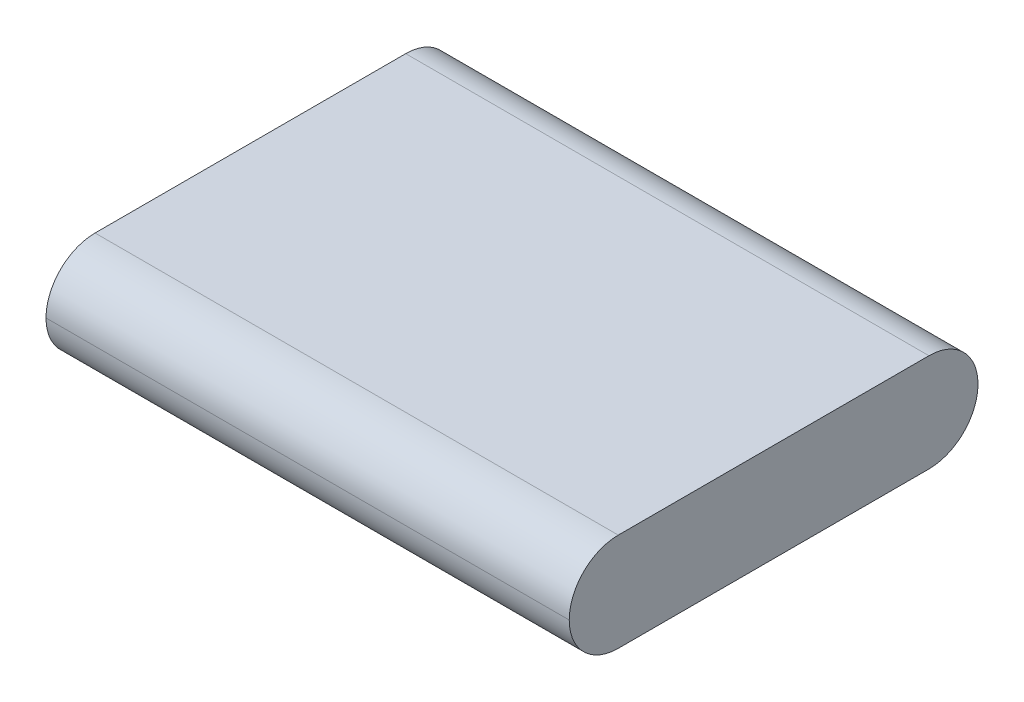
ISO-10303-21;
HEADER;
FILE_DESCRIPTION(('STEP AP214'),'2;1');
FILE_NAME('part.step','',(''),(''),'','','');
FILE_SCHEMA(('AUTOMOTIVE_DESIGN { 1 0 10303 214 1 1 1 1 }'));
ENDSEC;
DATA;
#1=APPLICATION_CONTEXT('core data for automotive mechanical design processes');
#2=APPLICATION_PROTOCOL_DEFINITION('international standard','automotive_design',2000,#1);
#3=PRODUCT_CONTEXT('',#1,'mechanical');
#4=PRODUCT('Part','Part','',(#3));
#5=PRODUCT_RELATED_PRODUCT_CATEGORY('part','',(#4));
#6=PRODUCT_DEFINITION_FORMATION('','',#4);
#7=PRODUCT_DEFINITION_CONTEXT('part definition',#1,'design');
#8=PRODUCT_DEFINITION('design','',#6,#7);
#9=PRODUCT_DEFINITION_SHAPE('','',#8);
#10=(LENGTH_UNIT() NAMED_UNIT(*) SI_UNIT(.MILLI.,.METRE.));
#11=(NAMED_UNIT(*) PLANE_ANGLE_UNIT() SI_UNIT($,.RADIAN.));
#12=(NAMED_UNIT(*) SI_UNIT($,.STERADIAN.) SOLID_ANGLE_UNIT());
#13=UNCERTAINTY_MEASURE_WITH_UNIT(LENGTH_MEASURE(1.E-05),#10,'distance_accuracy_value','');
#14=(GEOMETRIC_REPRESENTATION_CONTEXT(3) GLOBAL_UNCERTAINTY_ASSIGNED_CONTEXT((#13)) GLOBAL_UNIT_ASSIGNED_CONTEXT((#10,
#11,#12)) REPRESENTATION_CONTEXT('',''));
#15=CARTESIAN_POINT('',(0.,0.,0.));
#16=DIRECTION('',(0.,0.,1.));
#17=DIRECTION('',(1.,0.,0.));
#18=AXIS2_PLACEMENT_3D('',#15,#16,#17);
#19=CARTESIAN_POINT('',(-16.,6.,-12.5));
#20=DIRECTION('',(1.,0.,0.));
#21=DIRECTION('',(0.,0.,-1.));
#22=AXIS2_PLACEMENT_3D('',#19,#20,#21);
#23=PLANE('',#22);
#24=CARTESIAN_POINT('',(-16.,3.,-9.5));
#25=DIRECTION('',(1.,0.,0.));
#26=DIRECTION('',(0.,0.,-1.));
#27=AXIS2_PLACEMENT_3D('',#24,#25,#26);
#28=CIRCLE('',#27,3.);
#29=CARTESIAN_POINT('',(-16.,6.,-9.5));
#30=VERTEX_POINT('',#29);
#31=CARTESIAN_POINT('',(-16.,3.,-12.5));
#32=VERTEX_POINT('',#31);
#33=EDGE_CURVE('E99',#30,#32,#28,.F.);
#34=ORIENTED_EDGE('',*,*,#33,.T.);
#35=CARTESIAN_POINT('',(-16.,3.,-9.5));
#36=DIRECTION('',(1.,0.,0.));
#37=DIRECTION('',(0.,0.,-1.));
#38=AXIS2_PLACEMENT_3D('',#35,#36,#37);
#39=CIRCLE('',#38,3.);
#40=CARTESIAN_POINT('',(-16.,0.,-9.5));
#41=VERTEX_POINT('',#40);
#42=EDGE_CURVE('E93',#32,#41,#39,.F.);
#43=ORIENTED_EDGE('',*,*,#42,.T.);
#44=DIRECTION('',(0.,0.,1.));
#45=VECTOR('',#44,1.);
#46=CARTESIAN_POINT('',(-16.,0.,-12.5));
#47=LINE('',#46,#45);
#48=CARTESIAN_POINT('',(-16.,0.,9.5));
#49=VERTEX_POINT('',#48);
#50=EDGE_CURVE('E95',#41,#49,#47,.T.);
#51=ORIENTED_EDGE('',*,*,#50,.T.);
#52=CARTESIAN_POINT('',(-16.,3.,9.5));
#53=DIRECTION('',(1.,0.,0.));
#54=DIRECTION('',(0.,0.,-1.));
#55=AXIS2_PLACEMENT_3D('',#52,#53,#54);
#56=CIRCLE('',#55,3.);
#57=CARTESIAN_POINT('',(-16.,3.,12.5));
#58=VERTEX_POINT('',#57);
#59=EDGE_CURVE('E146',#49,#58,#56,.F.);
#60=ORIENTED_EDGE('',*,*,#59,.T.);
#61=CARTESIAN_POINT('',(-16.,3.,9.5));
#62=DIRECTION('',(1.,0.,0.));
#63=DIRECTION('',(0.,0.,-1.));
#64=AXIS2_PLACEMENT_3D('',#61,#62,#63);
#65=CIRCLE('',#64,3.);
#66=CARTESIAN_POINT('',(-16.,6.,9.5));
#67=VERTEX_POINT('',#66);
#68=EDGE_CURVE('E144',#58,#67,#65,.F.);
#69=ORIENTED_EDGE('',*,*,#68,.T.);
#70=DIRECTION('',(0.,0.,1.));
#71=VECTOR('',#70,1.);
#72=CARTESIAN_POINT('',(-16.,6.,-12.5));
#73=LINE('',#72,#71);
#74=EDGE_CURVE('E149',#30,#67,#73,.T.);
#75=ORIENTED_EDGE('',*,*,#74,.F.);
#76=EDGE_LOOP('',(#34,#43,#51,#60,#69,#75));
#77=FACE_BOUND('',#76,.T.);
#78=ADVANCED_FACE('F39',(#77),#23,.F.);
#79=CARTESIAN_POINT('',(16.,6.,-12.5));
#80=DIRECTION('',(-1.,0.,0.));
#81=DIRECTION('',(0.,0.,1.));
#82=AXIS2_PLACEMENT_3D('',#79,#80,#81);
#83=PLANE('',#82);
#84=DIRECTION('',(0.,0.,-1.));
#85=VECTOR('',#84,1.);
#86=CARTESIAN_POINT('',(16.,0.,-12.5));
#87=LINE('',#86,#85);
#88=CARTESIAN_POINT('',(16.,0.,9.49999999999999));
#89=VERTEX_POINT('',#88);
#90=CARTESIAN_POINT('',(16.,0.,-9.5));
#91=VERTEX_POINT('',#90);
#92=EDGE_CURVE('E115',#89,#91,#87,.T.);
#93=ORIENTED_EDGE('',*,*,#92,.T.);
#94=CARTESIAN_POINT('',(16.,3.,-9.5));
#95=DIRECTION('',(-1.,0.,0.));
#96=DIRECTION('',(0.,0.,1.));
#97=AXIS2_PLACEMENT_3D('',#94,#95,#96);
#98=CIRCLE('',#97,3.);
#99=CARTESIAN_POINT('',(16.,3.,-12.5));
#100=VERTEX_POINT('',#99);
#101=EDGE_CURVE('E119',#91,#100,#98,.F.);
#102=ORIENTED_EDGE('',*,*,#101,.T.);
#103=CARTESIAN_POINT('',(16.,3.,-9.5));
#104=DIRECTION('',(-1.,0.,0.));
#105=DIRECTION('',(0.,0.,1.));
#106=AXIS2_PLACEMENT_3D('',#103,#104,#105);
#107=CIRCLE('',#106,3.);
#108=CARTESIAN_POINT('',(16.,6.,-9.5));
#109=VERTEX_POINT('',#108);
#110=EDGE_CURVE('E63',#100,#109,#107,.F.);
#111=ORIENTED_EDGE('',*,*,#110,.T.);
#112=DIRECTION('',(0.,0.,-1.));
#113=VECTOR('',#112,1.);
#114=CARTESIAN_POINT('',(16.,6.,-12.5));
#115=LINE('',#114,#113);
#116=CARTESIAN_POINT('',(16.,6.,9.49999999999999));
#117=VERTEX_POINT('',#116);
#118=EDGE_CURVE('E153',#117,#109,#115,.T.);
#119=ORIENTED_EDGE('',*,*,#118,.F.);
#120=CARTESIAN_POINT('',(16.,3.,9.5));
#121=DIRECTION('',(-1.,0.,0.));
#122=DIRECTION('',(0.,0.,1.));
#123=AXIS2_PLACEMENT_3D('',#120,#121,#122);
#124=CIRCLE('',#123,3.);
#125=CARTESIAN_POINT('',(16.,3.,12.5));
#126=VERTEX_POINT('',#125);
#127=EDGE_CURVE('E57',#117,#126,#124,.F.);
#128=ORIENTED_EDGE('',*,*,#127,.T.);
#129=CARTESIAN_POINT('',(16.,3.,9.5));
#130=DIRECTION('',(-1.,0.,0.));
#131=DIRECTION('',(0.,0.,1.));
#132=AXIS2_PLACEMENT_3D('',#129,#130,#131);
#133=CIRCLE('',#132,3.);
#134=EDGE_CURVE('E121',#126,#89,#133,.F.);
#135=ORIENTED_EDGE('',*,*,#134,.T.);
#136=EDGE_LOOP('',(#93,#102,#111,#119,#128,#135));
#137=FACE_BOUND('',#136,.T.);
#138=ADVANCED_FACE('F147',(#137),#83,.F.);
#139=CARTESIAN_POINT('',(0.,6.,0.));
#140=DIRECTION('',(0.,1.,0.));
#141=DIRECTION('',(0.,0.,1.));
#142=AXIS2_PLACEMENT_3D('',#139,#140,#141);
#143=PLANE('',#142);
#144=ORIENTED_EDGE('',*,*,#118,.T.);
#145=DIRECTION('',(-1.,0.,0.));
#146=VECTOR('',#145,1.);
#147=CARTESIAN_POINT('',(-16.,6.,-9.5));
#148=LINE('',#147,#146);
#149=EDGE_CURVE('E11',#109,#30,#148,.T.);
#150=ORIENTED_EDGE('',*,*,#149,.T.);
#151=ORIENTED_EDGE('',*,*,#74,.T.);
#152=DIRECTION('',(1.,0.,0.));
#153=VECTOR('',#152,1.);
#154=CARTESIAN_POINT('',(16.,6.,9.5));
#155=LINE('',#154,#153);
#156=EDGE_CURVE('E49',#67,#117,#155,.T.);
#157=ORIENTED_EDGE('',*,*,#156,.T.);
#158=EDGE_LOOP('',(#144,#150,#151,#157));
#159=FACE_BOUND('',#158,.T.);
#160=ADVANCED_FACE('F165',(#159),#143,.T.);
#161=CARTESIAN_POINT('',(0.,0.,0.));
#162=DIRECTION('',(0.,1.,0.));
#163=DIRECTION('',(0.,0.,1.));
#164=AXIS2_PLACEMENT_3D('',#161,#162,#163);
#165=PLANE('',#164);
#166=ORIENTED_EDGE('',*,*,#50,.F.);
#167=DIRECTION('',(-1.,0.,0.));
#168=VECTOR('',#167,1.);
#169=CARTESIAN_POINT('',(0.,0.,-9.5));
#170=LINE('',#169,#168);
#171=EDGE_CURVE('E111',#41,#91,#170,.F.);
#172=ORIENTED_EDGE('',*,*,#171,.T.);
#173=ORIENTED_EDGE('',*,*,#92,.F.);
#174=DIRECTION('',(1.,0.,0.));
#175=VECTOR('',#174,1.);
#176=CARTESIAN_POINT('',(0.,0.,9.5));
#177=LINE('',#176,#175);
#178=EDGE_CURVE('E105',#89,#49,#177,.F.);
#179=ORIENTED_EDGE('',*,*,#178,.T.);
#180=EDGE_LOOP('',(#166,#172,#173,#179));
#181=FACE_BOUND('',#180,.T.);
#182=ADVANCED_FACE('F109',(#181),#165,.F.);
#183=CARTESIAN_POINT('',(0.,3.,-9.5));
#184=DIRECTION('',(1.,0.,0.));
#185=DIRECTION('',(0.,0.,-1.));
#186=AXIS2_PLACEMENT_3D('',#183,#184,#185);
#187=CYLINDRICAL_SURFACE('',#186,3.);
#188=ORIENTED_EDGE('',*,*,#149,.F.);
#189=ORIENTED_EDGE('',*,*,#110,.F.);
#190=DIRECTION('',(-1.,0.,0.));
#191=VECTOR('',#190,1.);
#192=CARTESIAN_POINT('',(16.,3.,-12.5));
#193=LINE('',#192,#191);
#194=EDGE_CURVE('E116',#32,#100,#193,.F.);
#195=ORIENTED_EDGE('',*,*,#194,.F.);
#196=ORIENTED_EDGE('',*,*,#33,.F.);
#197=EDGE_LOOP('',(#188,#189,#195,#196));
#198=FACE_BOUND('',#197,.T.);
#199=ADVANCED_FACE('F167',(#198),#187,.T.);
#200=CARTESIAN_POINT('',(-16.,3.,-9.5));
#201=DIRECTION('',(-1.,0.,0.));
#202=DIRECTION('',(0.,0.,1.));
#203=AXIS2_PLACEMENT_3D('',#200,#201,#202);
#204=CYLINDRICAL_SURFACE('',#203,3.);
#205=ORIENTED_EDGE('',*,*,#101,.F.);
#206=ORIENTED_EDGE('',*,*,#171,.F.);
#207=ORIENTED_EDGE('',*,*,#42,.F.);
#208=ORIENTED_EDGE('',*,*,#194,.T.);
#209=EDGE_LOOP('',(#205,#206,#207,#208));
#210=FACE_BOUND('',#209,.T.);
#211=ADVANCED_FACE('F118',(#210),#204,.T.);
#212=CARTESIAN_POINT('',(-16.,3.,9.5));
#213=DIRECTION('',(1.,0.,0.));
#214=DIRECTION('',(0.,0.,-1.));
#215=AXIS2_PLACEMENT_3D('',#212,#213,#214);
#216=CYLINDRICAL_SURFACE('',#215,3.);
#217=DIRECTION('',(1.,0.,0.));
#218=VECTOR('',#217,1.);
#219=CARTESIAN_POINT('',(-16.,3.,12.5));
#220=LINE('',#219,#218);
#221=EDGE_CURVE('E43',#58,#126,#220,.T.);
#222=ORIENTED_EDGE('',*,*,#221,.F.);
#223=ORIENTED_EDGE('',*,*,#59,.F.);
#224=ORIENTED_EDGE('',*,*,#178,.F.);
#225=ORIENTED_EDGE('',*,*,#134,.F.);
#226=EDGE_LOOP('',(#222,#223,#224,#225));
#227=FACE_BOUND('',#226,.T.);
#228=ADVANCED_FACE('F41',(#227),#216,.T.);
#229=CARTESIAN_POINT('',(0.,3.,9.5));
#230=DIRECTION('',(-1.,0.,0.));
#231=DIRECTION('',(0.,0.,1.));
#232=AXIS2_PLACEMENT_3D('',#229,#230,#231);
#233=CYLINDRICAL_SURFACE('',#232,3.);
#234=ORIENTED_EDGE('',*,*,#68,.F.);
#235=ORIENTED_EDGE('',*,*,#221,.T.);
#236=ORIENTED_EDGE('',*,*,#127,.F.);
#237=ORIENTED_EDGE('',*,*,#156,.F.);
#238=EDGE_LOOP('',(#234,#235,#236,#237));
#239=FACE_BOUND('',#238,.T.);
#240=ADVANCED_FACE('F142',(#239),#233,.T.);
#241=CLOSED_SHELL('',(#78,#138,#160,#182,#199,#211,#228,#240));
#242=MANIFOLD_SOLID_BREP('B2',#241);
#243=ADVANCED_BREP_SHAPE_REPRESENTATION('',(#18,#242),#14);
#244=SHAPE_DEFINITION_REPRESENTATION(#9,#243);
ENDSEC;
END-ISO-10303-21;
